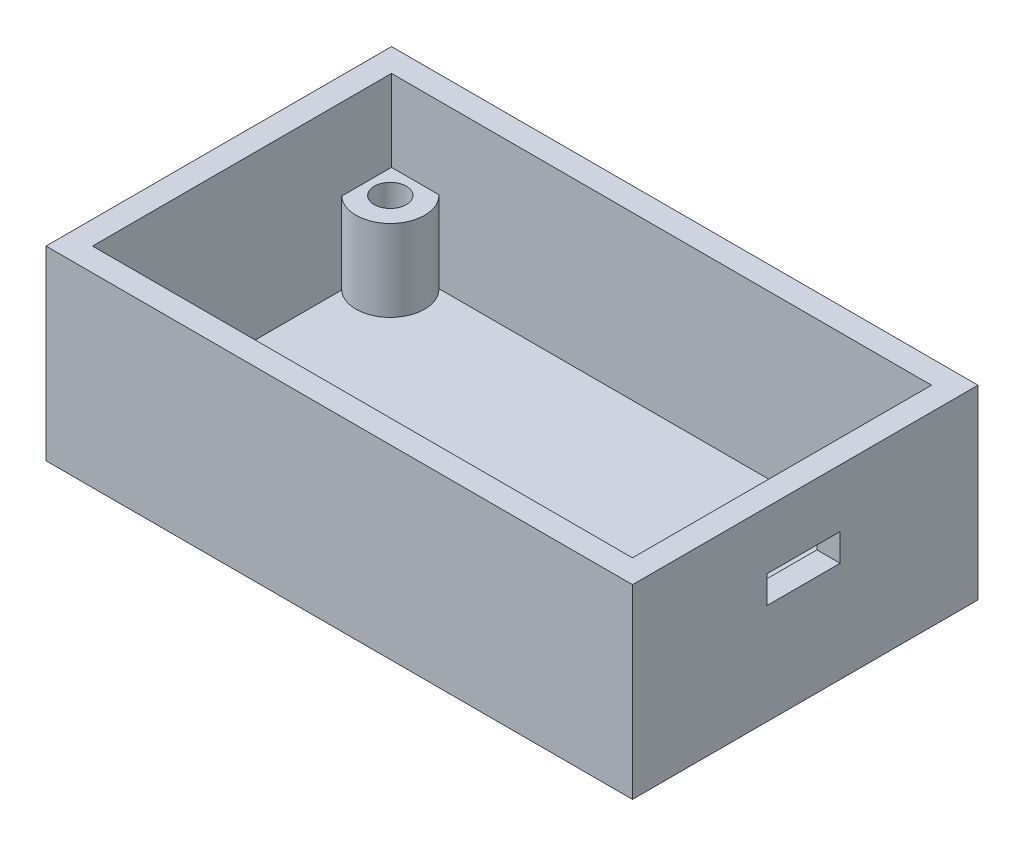
ISO-10303-21;
HEADER;
FILE_DESCRIPTION(('STEP AP214'),'2;1');
FILE_NAME('part.step','',(''),(''),'','','');
FILE_SCHEMA(('AUTOMOTIVE_DESIGN { 1 0 10303 214 1 1 1 1 }'));
ENDSEC;
DATA;
#1=APPLICATION_CONTEXT('core data for automotive mechanical design processes');
#2=APPLICATION_PROTOCOL_DEFINITION('international standard','automotive_design',2000,#1);
#3=PRODUCT_CONTEXT('',#1,'mechanical');
#4=PRODUCT('Part','Part','',(#3));
#5=PRODUCT_RELATED_PRODUCT_CATEGORY('part','',(#4));
#6=PRODUCT_DEFINITION_FORMATION('','',#4);
#7=PRODUCT_DEFINITION_CONTEXT('part definition',#1,'design');
#8=PRODUCT_DEFINITION('design','',#6,#7);
#9=PRODUCT_DEFINITION_SHAPE('','',#8);
#10=(LENGTH_UNIT() NAMED_UNIT(*) SI_UNIT(.MILLI.,.METRE.));
#11=(NAMED_UNIT(*) PLANE_ANGLE_UNIT() SI_UNIT($,.RADIAN.));
#12=(NAMED_UNIT(*) SI_UNIT($,.STERADIAN.) SOLID_ANGLE_UNIT());
#13=UNCERTAINTY_MEASURE_WITH_UNIT(LENGTH_MEASURE(1.E-05),#10,'distance_accuracy_value','');
#14=(GEOMETRIC_REPRESENTATION_CONTEXT(3) GLOBAL_UNCERTAINTY_ASSIGNED_CONTEXT((#13)) GLOBAL_UNIT_ASSIGNED_CONTEXT((#10,
#11,#12)) REPRESENTATION_CONTEXT('',''));
#15=CARTESIAN_POINT('',(0.,0.,0.));
#16=DIRECTION('',(0.,0.,1.));
#17=DIRECTION('',(1.,0.,0.));
#18=AXIS2_PLACEMENT_3D('',#15,#16,#17);
#19=CARTESIAN_POINT('',(-29.5,-17.78,16.3345));
#20=DIRECTION('',(0.,0.,1.));
#21=DIRECTION('',(1.,0.,0.));
#22=AXIS2_PLACEMENT_3D('',#19,#20,#21);
#23=PLANE('',#22);
#24=DIRECTION('',(1.,0.,0.));
#25=VECTOR('',#24,1.);
#26=CARTESIAN_POINT('',(-29.5,-8.89,16.3345));
#27=LINE('',#26,#25);
#28=CARTESIAN_POINT('',(-29.5,-8.89,16.3345));
#29=VERTEX_POINT('',#28);
#30=CARTESIAN_POINT('',(-24.3228,-8.89,16.3345));
#31=VERTEX_POINT('',#30);
#32=EDGE_CURVE('E217',#29,#31,#27,.T.);
#33=ORIENTED_EDGE('',*,*,#32,.F.);
#34=DIRECTION('',(0.,1.,0.));
#35=VECTOR('',#34,1.);
#36=CARTESIAN_POINT('',(-29.5,-17.78,16.3345));
#37=LINE('',#36,#35);
#38=CARTESIAN_POINT('',(-29.5,0.,16.3345));
#39=VERTEX_POINT('',#38);
#40=EDGE_CURVE('E298',#29,#39,#37,.T.);
#41=ORIENTED_EDGE('',*,*,#40,.T.);
#42=DIRECTION('',(1.,0.,0.));
#43=VECTOR('',#42,1.);
#44=CARTESIAN_POINT('',(-29.5,0.,16.3345));
#45=LINE('',#44,#43);
#46=CARTESIAN_POINT('',(29.5,0.,16.3345));
#47=VERTEX_POINT('',#46);
#48=EDGE_CURVE('E276',#39,#47,#45,.T.);
#49=ORIENTED_EDGE('',*,*,#48,.T.);
#50=DIRECTION('',(0.,1.,0.));
#51=VECTOR('',#50,1.);
#52=CARTESIAN_POINT('',(29.5,-17.78,16.3345));
#53=LINE('',#52,#51);
#54=CARTESIAN_POINT('',(29.5,-8.89,16.3345));
#55=VERTEX_POINT('',#54);
#56=EDGE_CURVE('E287',#55,#47,#53,.T.);
#57=ORIENTED_EDGE('',*,*,#56,.F.);
#58=DIRECTION('',(1.,0.,0.));
#59=VECTOR('',#58,1.);
#60=CARTESIAN_POINT('',(29.5,-8.89,16.3345));
#61=LINE('',#60,#59);
#62=CARTESIAN_POINT('',(24.3228,-8.89,16.3345));
#63=VERTEX_POINT('',#62);
#64=EDGE_CURVE('E231',#63,#55,#61,.T.);
#65=ORIENTED_EDGE('',*,*,#64,.F.);
#66=DIRECTION('',(0.,-1.,0.));
#67=VECTOR('',#66,1.);
#68=CARTESIAN_POINT('',(24.3228,-8.89,16.3345));
#69=LINE('',#68,#67);
#70=CARTESIAN_POINT('',(24.3228,-17.78,16.3345));
#71=VERTEX_POINT('',#70);
#72=EDGE_CURVE('E239',#63,#71,#69,.T.);
#73=ORIENTED_EDGE('',*,*,#72,.T.);
#74=DIRECTION('',(1.,0.,0.));
#75=VECTOR('',#74,1.);
#76=CARTESIAN_POINT('',(-29.5,-17.78,16.3345));
#77=LINE('',#76,#75);
#78=CARTESIAN_POINT('',(-24.3228,-17.78,16.3345));
#79=VERTEX_POINT('',#78);
#80=EDGE_CURVE('E277',#79,#71,#77,.T.);
#81=ORIENTED_EDGE('',*,*,#80,.F.);
#82=DIRECTION('',(0.,-1.,0.));
#83=VECTOR('',#82,1.);
#84=CARTESIAN_POINT('',(-24.3228,-8.89,16.3345));
#85=LINE('',#84,#83);
#86=EDGE_CURVE('E219',#31,#79,#85,.T.);
#87=ORIENTED_EDGE('',*,*,#86,.F.);
#88=EDGE_LOOP('',(#33,#41,#49,#57,#65,#73,#81,#87));
#89=FACE_BOUND('',#88,.T.);
#90=ADVANCED_FACE('F35',(#89),#23,.F.);
#91=CARTESIAN_POINT('',(-29.5,-17.78,16.3345));
#92=DIRECTION('',(1.,0.,0.));
#93=DIRECTION('',(0.,0.,-1.));
#94=AXIS2_PLACEMENT_3D('',#91,#92,#93);
#95=PLANE('',#94);
#96=ORIENTED_EDGE('',*,*,#40,.F.);
#97=DIRECTION('',(0.,0.,1.));
#98=VECTOR('',#97,1.);
#99=CARTESIAN_POINT('',(-29.5,-8.89,10.897080826546));
#100=LINE('',#99,#98);
#101=CARTESIAN_POINT('',(-29.5,-8.89,10.897080826546));
#102=VERTEX_POINT('',#101);
#103=EDGE_CURVE('E215',#102,#29,#100,.T.);
#104=ORIENTED_EDGE('',*,*,#103,.F.);
#105=DIRECTION('',(0.,-1.,0.));
#106=VECTOR('',#105,1.);
#107=CARTESIAN_POINT('',(-29.5,-8.89,10.897080826546));
#108=LINE('',#107,#106);
#109=CARTESIAN_POINT('',(-29.5,-17.78,10.897080826546));
#110=VERTEX_POINT('',#109);
#111=EDGE_CURVE('E222',#102,#110,#108,.T.);
#112=ORIENTED_EDGE('',*,*,#111,.T.);
#113=DIRECTION('',(0.,0.,-1.));
#114=VECTOR('',#113,1.);
#115=CARTESIAN_POINT('',(-29.5,-17.78,16.3345));
#116=LINE('',#115,#114);
#117=CARTESIAN_POINT('',(-29.5,-17.78,-10.897080826546));
#118=VERTEX_POINT('',#117);
#119=EDGE_CURVE('E285',#110,#118,#116,.T.);
#120=ORIENTED_EDGE('',*,*,#119,.T.);
#121=DIRECTION('',(0.,-1.,0.));
#122=VECTOR('',#121,1.);
#123=CARTESIAN_POINT('',(-29.5,-8.89,-10.897080826546));
#124=LINE('',#123,#122);
#125=CARTESIAN_POINT('',(-29.5,-8.89,-10.897080826546));
#126=VERTEX_POINT('',#125);
#127=EDGE_CURVE('E269',#126,#118,#124,.T.);
#128=ORIENTED_EDGE('',*,*,#127,.F.);
#129=DIRECTION('',(0.,0.,1.));
#130=VECTOR('',#129,1.);
#131=CARTESIAN_POINT('',(-29.5,-8.89,-10.897080826546));
#132=LINE('',#131,#130);
#133=CARTESIAN_POINT('',(-29.5,-8.89,-16.3345));
#134=VERTEX_POINT('',#133);
#135=EDGE_CURVE('E267',#134,#126,#132,.T.);
#136=ORIENTED_EDGE('',*,*,#135,.F.);
#137=DIRECTION('',(0.,1.,0.));
#138=VECTOR('',#137,1.);
#139=CARTESIAN_POINT('',(-29.5,-17.78,-16.3345));
#140=LINE('',#139,#138);
#141=CARTESIAN_POINT('',(-29.5,0.,-16.3345));
#142=VERTEX_POINT('',#141);
#143=EDGE_CURVE('E301',#134,#142,#140,.T.);
#144=ORIENTED_EDGE('',*,*,#143,.T.);
#145=DIRECTION('',(0.,0.,-1.));
#146=VECTOR('',#145,1.);
#147=CARTESIAN_POINT('',(-29.5,0.,16.3345));
#148=LINE('',#147,#146);
#149=EDGE_CURVE('E280',#39,#142,#148,.T.);
#150=ORIENTED_EDGE('',*,*,#149,.F.);
#151=EDGE_LOOP('',(#96,#104,#112,#120,#128,#136,#144,#150));
#152=FACE_BOUND('',#151,.T.);
#153=ADVANCED_FACE('F376',(#152),#95,.T.);
#154=CARTESIAN_POINT('',(-29.5,-17.78,-16.3345));
#155=DIRECTION('',(0.,0.,1.));
#156=DIRECTION('',(1.,0.,0.));
#157=AXIS2_PLACEMENT_3D('',#154,#155,#156);
#158=PLANE('',#157);
#159=DIRECTION('',(0.,-1.,0.));
#160=VECTOR('',#159,1.);
#161=CARTESIAN_POINT('',(24.3228,-8.89,-16.3345));
#162=LINE('',#161,#160);
#163=CARTESIAN_POINT('',(24.3228,-8.89,-16.3345));
#164=VERTEX_POINT('',#163);
#165=CARTESIAN_POINT('',(24.3228,-17.78,-16.3345));
#166=VERTEX_POINT('',#165);
#167=EDGE_CURVE('E252',#164,#166,#162,.T.);
#168=ORIENTED_EDGE('',*,*,#167,.F.);
#169=DIRECTION('',(-1.,0.,0.));
#170=VECTOR('',#169,1.);
#171=CARTESIAN_POINT('',(29.5,-8.89,-16.3345));
#172=LINE('',#171,#170);
#173=CARTESIAN_POINT('',(29.5,-8.89,-16.3345));
#174=VERTEX_POINT('',#173);
#175=EDGE_CURVE('E250',#174,#164,#172,.T.);
#176=ORIENTED_EDGE('',*,*,#175,.F.);
#177=DIRECTION('',(0.,1.,0.));
#178=VECTOR('',#177,1.);
#179=CARTESIAN_POINT('',(29.5,-17.78,-16.3345));
#180=LINE('',#179,#178);
#181=CARTESIAN_POINT('',(29.5,0.,-16.3345));
#182=VERTEX_POINT('',#181);
#183=EDGE_CURVE('E303',#174,#182,#180,.T.);
#184=ORIENTED_EDGE('',*,*,#183,.T.);
#185=DIRECTION('',(1.,0.,0.));
#186=VECTOR('',#185,1.);
#187=CARTESIAN_POINT('',(-29.5,0.,-16.3345));
#188=LINE('',#187,#186);
#189=EDGE_CURVE('E293',#142,#182,#188,.T.);
#190=ORIENTED_EDGE('',*,*,#189,.F.);
#191=ORIENTED_EDGE('',*,*,#143,.F.);
#192=DIRECTION('',(-1.,0.,0.));
#193=VECTOR('',#192,1.);
#194=CARTESIAN_POINT('',(-29.5,-8.89,-16.3345));
#195=LINE('',#194,#193);
#196=CARTESIAN_POINT('',(-24.3228,-8.89,-16.3345));
#197=VERTEX_POINT('',#196);
#198=EDGE_CURVE('E265',#197,#134,#195,.T.);
#199=ORIENTED_EDGE('',*,*,#198,.F.);
#200=DIRECTION('',(0.,-1.,0.));
#201=VECTOR('',#200,1.);
#202=CARTESIAN_POINT('',(-24.3228,-8.89,-16.3345));
#203=LINE('',#202,#201);
#204=CARTESIAN_POINT('',(-24.3228,-17.78,-16.3345));
#205=VERTEX_POINT('',#204);
#206=EDGE_CURVE('E273',#197,#205,#203,.T.);
#207=ORIENTED_EDGE('',*,*,#206,.T.);
#208=DIRECTION('',(1.,0.,0.));
#209=VECTOR('',#208,1.);
#210=CARTESIAN_POINT('',(-29.5,-17.78,-16.3345));
#211=LINE('',#210,#209);
#212=EDGE_CURVE('E282',#205,#166,#211,.T.);
#213=ORIENTED_EDGE('',*,*,#212,.T.);
#214=EDGE_LOOP('',(#168,#176,#184,#190,#191,#199,#207,#213));
#215=FACE_BOUND('',#214,.T.);
#216=ADVANCED_FACE('F382',(#215),#158,.T.);
#217=CARTESIAN_POINT('',(29.5,-17.78,16.3345));
#218=DIRECTION('',(1.,0.,0.));
#219=DIRECTION('',(0.,0.,-1.));
#220=AXIS2_PLACEMENT_3D('',#217,#218,#219);
#221=PLANE('',#220);
#222=DIRECTION('',(0.,0.,-1.));
#223=VECTOR('',#222,1.);
#224=CARTESIAN_POINT('',(29.5,-9.32,16.3345));
#225=LINE('',#224,#223);
#226=CARTESIAN_POINT('',(29.5,-9.32,4.19));
#227=VERTEX_POINT('',#226);
#228=CARTESIAN_POINT('',(29.5,-9.32,-3.81));
#229=VERTEX_POINT('',#228);
#230=EDGE_CURVE('E203',#227,#229,#225,.T.);
#231=ORIENTED_EDGE('',*,*,#230,.T.);
#232=DIRECTION('',(0.,1.,0.));
#233=VECTOR('',#232,1.);
#234=CARTESIAN_POINT('',(29.5,-17.78,-3.81));
#235=LINE('',#234,#233);
#236=CARTESIAN_POINT('',(29.5,-6.32,-3.81));
#237=VERTEX_POINT('',#236);
#238=EDGE_CURVE('E206',#229,#237,#235,.T.);
#239=ORIENTED_EDGE('',*,*,#238,.T.);
#240=DIRECTION('',(0.,0.,1.));
#241=VECTOR('',#240,1.);
#242=CARTESIAN_POINT('',(29.5,-6.32,16.3345));
#243=LINE('',#242,#241);
#244=CARTESIAN_POINT('',(29.5,-6.32,4.19));
#245=VERTEX_POINT('',#244);
#246=EDGE_CURVE('E198',#237,#245,#243,.T.);
#247=ORIENTED_EDGE('',*,*,#246,.T.);
#248=DIRECTION('',(0.,-1.,0.));
#249=VECTOR('',#248,1.);
#250=CARTESIAN_POINT('',(29.5,-17.78,4.19));
#251=LINE('',#250,#249);
#252=EDGE_CURVE('E178',#245,#227,#251,.T.);
#253=ORIENTED_EDGE('',*,*,#252,.T.);
#254=EDGE_LOOP('',(#231,#239,#247,#253));
#255=FACE_BOUND('',#254,.T.);
#256=DIRECTION('',(0.,-1.,0.));
#257=VECTOR('',#256,1.);
#258=CARTESIAN_POINT('',(29.5,-8.89,10.897080826546));
#259=LINE('',#258,#257);
#260=CARTESIAN_POINT('',(29.5,-8.89,10.897080826546));
#261=VERTEX_POINT('',#260);
#262=CARTESIAN_POINT('',(29.5,-17.78,10.897080826546));
#263=VERTEX_POINT('',#262);
#264=EDGE_CURVE('E235',#261,#263,#259,.T.);
#265=ORIENTED_EDGE('',*,*,#264,.F.);
#266=DIRECTION('',(0.,0.,-1.));
#267=VECTOR('',#266,1.);
#268=CARTESIAN_POINT('',(29.5,-8.89,10.897080826546));
#269=LINE('',#268,#267);
#270=EDGE_CURVE('E233',#55,#261,#269,.T.);
#271=ORIENTED_EDGE('',*,*,#270,.F.);
#272=ORIENTED_EDGE('',*,*,#56,.T.);
#273=DIRECTION('',(0.,0.,-1.));
#274=VECTOR('',#273,1.);
#275=CARTESIAN_POINT('',(29.5,0.,16.3345));
#276=LINE('',#275,#274);
#277=EDGE_CURVE('E290',#47,#182,#276,.T.);
#278=ORIENTED_EDGE('',*,*,#277,.T.);
#279=ORIENTED_EDGE('',*,*,#183,.F.);
#280=DIRECTION('',(0.,0.,-1.));
#281=VECTOR('',#280,1.);
#282=CARTESIAN_POINT('',(29.5,-8.89,-10.897080826546));
#283=LINE('',#282,#281);
#284=CARTESIAN_POINT('',(29.5,-8.89,-10.897080826546));
#285=VERTEX_POINT('',#284);
#286=EDGE_CURVE('E248',#285,#174,#283,.T.);
#287=ORIENTED_EDGE('',*,*,#286,.F.);
#288=DIRECTION('',(0.,-1.,0.));
#289=VECTOR('',#288,1.);
#290=CARTESIAN_POINT('',(29.5,-8.89,-10.897080826546));
#291=LINE('',#290,#289);
#292=CARTESIAN_POINT('',(29.5,-17.78,-10.897080826546));
#293=VERTEX_POINT('',#292);
#294=EDGE_CURVE('E256',#285,#293,#291,.T.);
#295=ORIENTED_EDGE('',*,*,#294,.T.);
#296=DIRECTION('',(0.,0.,-1.));
#297=VECTOR('',#296,1.);
#298=CARTESIAN_POINT('',(29.5,-17.78,16.3345));
#299=LINE('',#298,#297);
#300=EDGE_CURVE('E279',#263,#293,#299,.T.);
#301=ORIENTED_EDGE('',*,*,#300,.F.);
#302=EDGE_LOOP('',(#265,#271,#272,#278,#279,#287,#295,#301));
#303=FACE_BOUND('',#302,.T.);
#304=ADVANCED_FACE('F387',(#255,#303),#221,.F.);
#305=CARTESIAN_POINT('',(-32.04,-20.32,18.8745));
#306=DIRECTION('',(1.,0.,0.));
#307=DIRECTION('',(0.,0.,-1.));
#308=AXIS2_PLACEMENT_3D('',#305,#306,#307);
#309=PLANE('',#308);
#310=DIRECTION('',(0.,0.,-1.));
#311=VECTOR('',#310,1.);
#312=CARTESIAN_POINT('',(-32.04,0.,18.8745));
#313=LINE('',#312,#311);
#314=CARTESIAN_POINT('',(-32.04,0.,18.8745));
#315=VERTEX_POINT('',#314);
#316=CARTESIAN_POINT('',(-32.04,0.,-18.8745));
#317=VERTEX_POINT('',#316);
#318=EDGE_CURVE('E300',#315,#317,#313,.T.);
#319=ORIENTED_EDGE('',*,*,#318,.T.);
#320=DIRECTION('',(0.,1.,0.));
#321=VECTOR('',#320,1.);
#322=CARTESIAN_POINT('',(-32.04,-20.32,-18.8745));
#323=LINE('',#322,#321);
#324=CARTESIAN_POINT('',(-32.04,-20.32,-18.8745));
#325=VERTEX_POINT('',#324);
#326=EDGE_CURVE('E334',#325,#317,#323,.T.);
#327=ORIENTED_EDGE('',*,*,#326,.F.);
#328=DIRECTION('',(0.,0.,-1.));
#329=VECTOR('',#328,1.);
#330=CARTESIAN_POINT('',(-32.04,-20.32,18.8745));
#331=LINE('',#330,#329);
#332=CARTESIAN_POINT('',(-32.04,-20.32,18.8745));
#333=VERTEX_POINT('',#332);
#334=EDGE_CURVE('E306',#333,#325,#331,.T.);
#335=ORIENTED_EDGE('',*,*,#334,.F.);
#336=DIRECTION('',(0.,1.,0.));
#337=VECTOR('',#336,1.);
#338=CARTESIAN_POINT('',(-32.04,-20.32,18.8745));
#339=LINE('',#338,#337);
#340=EDGE_CURVE('E318',#333,#315,#339,.T.);
#341=ORIENTED_EDGE('',*,*,#340,.T.);
#342=EDGE_LOOP('',(#319,#327,#335,#341));
#343=FACE_BOUND('',#342,.T.);
#344=ADVANCED_FACE('F37',(#343),#309,.F.);
#345=CARTESIAN_POINT('',(-32.04,-20.32,-18.8745));
#346=DIRECTION('',(0.,0.,1.));
#347=DIRECTION('',(1.,0.,0.));
#348=AXIS2_PLACEMENT_3D('',#345,#346,#347);
#349=PLANE('',#348);
#350=DIRECTION('',(1.,0.,0.));
#351=VECTOR('',#350,1.);
#352=CARTESIAN_POINT('',(-32.04,0.,-18.8745));
#353=LINE('',#352,#351);
#354=CARTESIAN_POINT('',(32.04,0.,-18.8745));
#355=VERTEX_POINT('',#354);
#356=EDGE_CURVE('E321',#317,#355,#353,.T.);
#357=ORIENTED_EDGE('',*,*,#356,.T.);
#358=DIRECTION('',(0.,1.,0.));
#359=VECTOR('',#358,1.);
#360=CARTESIAN_POINT('',(32.04,-20.32,-18.8745));
#361=LINE('',#360,#359);
#362=CARTESIAN_POINT('',(32.04,-20.32,-18.8745));
#363=VERTEX_POINT('',#362);
#364=EDGE_CURVE('E332',#363,#355,#361,.T.);
#365=ORIENTED_EDGE('',*,*,#364,.F.);
#366=DIRECTION('',(1.,0.,0.));
#367=VECTOR('',#366,1.);
#368=CARTESIAN_POINT('',(-32.04,-20.32,-18.8745));
#369=LINE('',#368,#367);
#370=EDGE_CURVE('E309',#325,#363,#369,.T.);
#371=ORIENTED_EDGE('',*,*,#370,.F.);
#372=ORIENTED_EDGE('',*,*,#326,.T.);
#373=EDGE_LOOP('',(#357,#365,#371,#372));
#374=FACE_BOUND('',#373,.T.);
#375=ADVANCED_FACE('F402',(#374),#349,.F.);
#376=CARTESIAN_POINT('',(32.04,-20.32,18.8745));
#377=DIRECTION('',(1.,0.,0.));
#378=DIRECTION('',(0.,0.,-1.));
#379=AXIS2_PLACEMENT_3D('',#376,#377,#378);
#380=PLANE('',#379);
#381=DIRECTION('',(0.,1.,0.));
#382=VECTOR('',#381,1.);
#383=CARTESIAN_POINT('',(32.04,-6.32,-3.81000000000001));
#384=LINE('',#383,#382);
#385=CARTESIAN_POINT('',(32.04,-9.32,-3.81000000000001));
#386=VERTEX_POINT('',#385);
#387=CARTESIAN_POINT('',(32.04,-6.32,-3.81));
#388=VERTEX_POINT('',#387);
#389=EDGE_CURVE('E58',#386,#388,#384,.T.);
#390=ORIENTED_EDGE('',*,*,#389,.F.);
#391=DIRECTION('',(0.,0.,-1.));
#392=VECTOR('',#391,1.);
#393=CARTESIAN_POINT('',(32.04,-9.32,4.19));
#394=LINE('',#393,#392);
#395=CARTESIAN_POINT('',(32.04,-9.32,4.19));
#396=VERTEX_POINT('',#395);
#397=EDGE_CURVE('E191',#396,#386,#394,.T.);
#398=ORIENTED_EDGE('',*,*,#397,.F.);
#399=DIRECTION('',(0.,-1.,0.));
#400=VECTOR('',#399,1.);
#401=CARTESIAN_POINT('',(32.04,-6.32,4.19));
#402=LINE('',#401,#400);
#403=CARTESIAN_POINT('',(32.04,-6.32,4.19));
#404=VERTEX_POINT('',#403);
#405=EDGE_CURVE('E175',#404,#396,#402,.T.);
#406=ORIENTED_EDGE('',*,*,#405,.F.);
#407=DIRECTION('',(0.,0.,1.));
#408=VECTOR('',#407,1.);
#409=CARTESIAN_POINT('',(32.04,-6.32,4.19));
#410=LINE('',#409,#408);
#411=EDGE_CURVE('E184',#388,#404,#410,.T.);
#412=ORIENTED_EDGE('',*,*,#411,.F.);
#413=EDGE_LOOP('',(#390,#398,#406,#412));
#414=FACE_BOUND('',#413,.T.);
#415=DIRECTION('',(0.,0.,-1.));
#416=VECTOR('',#415,1.);
#417=CARTESIAN_POINT('',(32.04,0.,18.8745));
#418=LINE('',#417,#416);
#419=CARTESIAN_POINT('',(32.04,0.,18.8745));
#420=VERTEX_POINT('',#419);
#421=EDGE_CURVE('E324',#420,#355,#418,.T.);
#422=ORIENTED_EDGE('',*,*,#421,.F.);
#423=DIRECTION('',(0.,1.,0.));
#424=VECTOR('',#423,1.);
#425=CARTESIAN_POINT('',(32.04,-20.32,18.8745));
#426=LINE('',#425,#424);
#427=CARTESIAN_POINT('',(32.04,-20.32,18.8745));
#428=VERTEX_POINT('',#427);
#429=EDGE_CURVE('E330',#428,#420,#426,.T.);
#430=ORIENTED_EDGE('',*,*,#429,.F.);
#431=DIRECTION('',(0.,0.,-1.));
#432=VECTOR('',#431,1.);
#433=CARTESIAN_POINT('',(32.04,-20.32,18.8745));
#434=LINE('',#433,#432);
#435=EDGE_CURVE('E312',#428,#363,#434,.T.);
#436=ORIENTED_EDGE('',*,*,#435,.T.);
#437=ORIENTED_EDGE('',*,*,#364,.T.);
#438=EDGE_LOOP('',(#422,#430,#436,#437));
#439=FACE_BOUND('',#438,.T.);
#440=ADVANCED_FACE('F188',(#414,#439),#380,.T.);
#441=CARTESIAN_POINT('',(-32.04,-20.32,18.8745));
#442=DIRECTION('',(0.,0.,1.));
#443=DIRECTION('',(1.,0.,0.));
#444=AXIS2_PLACEMENT_3D('',#441,#442,#443);
#445=PLANE('',#444);
#446=DIRECTION('',(1.,0.,0.));
#447=VECTOR('',#446,1.);
#448=CARTESIAN_POINT('',(-32.04,0.,18.8745));
#449=LINE('',#448,#447);
#450=EDGE_CURVE('E310',#315,#420,#449,.T.);
#451=ORIENTED_EDGE('',*,*,#450,.F.);
#452=ORIENTED_EDGE('',*,*,#340,.F.);
#453=DIRECTION('',(1.,0.,0.));
#454=VECTOR('',#453,1.);
#455=CARTESIAN_POINT('',(-32.04,-20.32,18.8745));
#456=LINE('',#455,#454);
#457=EDGE_CURVE('E315',#333,#428,#456,.T.);
#458=ORIENTED_EDGE('',*,*,#457,.T.);
#459=ORIENTED_EDGE('',*,*,#429,.T.);
#460=EDGE_LOOP('',(#451,#452,#458,#459));
#461=FACE_BOUND('',#460,.T.);
#462=ADVANCED_FACE('F393',(#461),#445,.T.);
#463=CARTESIAN_POINT('',(0.,-20.32,0.));
#464=DIRECTION('',(0.,-1.,0.));
#465=DIRECTION('',(0.,0.,-1.));
#466=AXIS2_PLACEMENT_3D('',#463,#464,#465);
#467=PLANE('',#466);
#468=ORIENTED_EDGE('',*,*,#334,.T.);
#469=ORIENTED_EDGE('',*,*,#370,.T.);
#470=ORIENTED_EDGE('',*,*,#435,.F.);
#471=ORIENTED_EDGE('',*,*,#457,.F.);
#472=EDGE_LOOP('',(#468,#469,#470,#471));
#473=FACE_BOUND('',#472,.T.);
#474=ADVANCED_FACE('F389',(#473),#467,.T.);
#475=CARTESIAN_POINT('',(0.,0.,0.));
#476=DIRECTION('',(0.,-1.,0.));
#477=DIRECTION('',(0.,0.,-1.));
#478=AXIS2_PLACEMENT_3D('',#475,#476,#477);
#479=PLANE('',#478);
#480=ORIENTED_EDGE('',*,*,#277,.F.);
#481=ORIENTED_EDGE('',*,*,#48,.F.);
#482=ORIENTED_EDGE('',*,*,#149,.T.);
#483=ORIENTED_EDGE('',*,*,#189,.T.);
#484=EDGE_LOOP('',(#480,#481,#482,#483));
#485=FACE_BOUND('',#484,.T.);
#486=ORIENTED_EDGE('',*,*,#318,.F.);
#487=ORIENTED_EDGE('',*,*,#450,.T.);
#488=ORIENTED_EDGE('',*,*,#421,.T.);
#489=ORIENTED_EDGE('',*,*,#356,.F.);
#490=EDGE_LOOP('',(#486,#487,#488,#489));
#491=FACE_BOUND('',#490,.T.);
#492=ADVANCED_FACE('F392',(#485,#491),#479,.F.);
#493=CARTESIAN_POINT('',(0.,-17.78,0.));
#494=DIRECTION('',(0.,1.,0.));
#495=DIRECTION('',(0.,0.,1.));
#496=AXIS2_PLACEMENT_3D('',#493,#494,#495);
#497=PLANE('',#496);
#498=ORIENTED_EDGE('',*,*,#119,.F.);
#499=CARTESIAN_POINT('',(-26.9114,-17.78,13.615790413273));
#500=DIRECTION('',(0.,1.,0.));
#501=DIRECTION('',(0.,0.,-1.));
#502=AXIS2_PLACEMENT_3D('',#499,#500,#501);
#503=CIRCLE('',#502,3.75396214378372);
#504=EDGE_CURVE('E212',#79,#110,#503,.T.);
#505=ORIENTED_EDGE('',*,*,#504,.F.);
#506=ORIENTED_EDGE('',*,*,#80,.T.);
#507=CARTESIAN_POINT('',(26.9114,-17.78,13.615790413273));
#508=DIRECTION('',(0.,1.,0.));
#509=DIRECTION('',(0.,0.,1.));
#510=AXIS2_PLACEMENT_3D('',#507,#508,#509);
#511=CIRCLE('',#510,3.75396214378372);
#512=EDGE_CURVE('E228',#263,#71,#511,.T.);
#513=ORIENTED_EDGE('',*,*,#512,.F.);
#514=ORIENTED_EDGE('',*,*,#300,.T.);
#515=CARTESIAN_POINT('',(26.9114,-17.78,-13.6157904132731));
#516=DIRECTION('',(0.,1.,0.));
#517=DIRECTION('',(0.,0.,-1.));
#518=AXIS2_PLACEMENT_3D('',#515,#516,#517);
#519=CIRCLE('',#518,3.75396214378372);
#520=EDGE_CURVE('E245',#166,#293,#519,.T.);
#521=ORIENTED_EDGE('',*,*,#520,.F.);
#522=ORIENTED_EDGE('',*,*,#212,.F.);
#523=CARTESIAN_POINT('',(-26.9114,-17.78,-13.615790413273));
#524=DIRECTION('',(0.,1.,0.));
#525=DIRECTION('',(0.,0.,1.));
#526=AXIS2_PLACEMENT_3D('',#523,#524,#525);
#527=CIRCLE('',#526,3.75396214378372);
#528=EDGE_CURVE('E262',#118,#205,#527,.T.);
#529=ORIENTED_EDGE('',*,*,#528,.F.);
#530=EDGE_LOOP('',(#498,#505,#506,#513,#514,#521,#522,#529));
#531=FACE_BOUND('',#530,.T.);
#532=ADVANCED_FACE('F363',(#531),#497,.T.);
#533=CARTESIAN_POINT('',(-26.9114,-8.89,-13.615790413273));
#534=DIRECTION('',(0.,1.,0.));
#535=DIRECTION('',(0.,0.,1.));
#536=AXIS2_PLACEMENT_3D('',#533,#534,#535);
#537=PLANE('',#536);
#538=CARTESIAN_POINT('',(-26.9114,-8.89,-13.615790413273));
#539=DIRECTION('',(0.,1.,0.));
#540=DIRECTION('',(0.,0.,1.));
#541=AXIS2_PLACEMENT_3D('',#538,#539,#540);
#542=CIRCLE('',#541,3.75396214378372);
#543=EDGE_CURVE('E263',#126,#197,#542,.T.);
#544=ORIENTED_EDGE('',*,*,#543,.T.);
#545=ORIENTED_EDGE('',*,*,#198,.T.);
#546=ORIENTED_EDGE('',*,*,#135,.T.);
#547=EDGE_LOOP('',(#544,#545,#546));
#548=FACE_BOUND('',#547,.T.);
#549=CARTESIAN_POINT('',(-26.9114,-8.89,-13.615790413273));
#550=DIRECTION('',(0.,1.,0.));
#551=DIRECTION('',(0.,0.,1.));
#552=AXIS2_PLACEMENT_3D('',#549,#550,#551);
#553=CIRCLE('',#552,1.75);
#554=CARTESIAN_POINT('',(-26.9114,-8.89,-11.865790413273));
#555=VERTEX_POINT('',#554);
#556=EDGE_CURVE('E259',#555,#555,#553,.T.);
#557=ORIENTED_EDGE('',*,*,#556,.F.);
#558=EDGE_LOOP('',(#557));
#559=FACE_BOUND('',#558,.T.);
#560=ADVANCED_FACE('F469',(#548,#559),#537,.T.);
#561=CARTESIAN_POINT('',(-26.9114,-8.89,-13.615790413273));
#562=DIRECTION('',(0.,-1.,0.));
#563=DIRECTION('',(0.,0.,-1.));
#564=AXIS2_PLACEMENT_3D('',#561,#562,#563);
#565=CYLINDRICAL_SURFACE('',#564,3.75396214378372);
#566=ORIENTED_EDGE('',*,*,#528,.T.);
#567=ORIENTED_EDGE('',*,*,#206,.F.);
#568=ORIENTED_EDGE('',*,*,#543,.F.);
#569=ORIENTED_EDGE('',*,*,#127,.T.);
#570=EDGE_LOOP('',(#566,#567,#568,#569));
#571=FACE_BOUND('',#570,.T.);
#572=ADVANCED_FACE('F467',(#571),#565,.T.);
#573=CARTESIAN_POINT('',(-26.9114,-8.89,-13.615790413273));
#574=DIRECTION('',(0.,-1.,0.));
#575=DIRECTION('',(0.,0.,-1.));
#576=AXIS2_PLACEMENT_3D('',#573,#574,#575);
#577=CYLINDRICAL_SURFACE('',#576,1.75);
#578=ORIENTED_EDGE('',*,*,#556,.T.);
#579=EDGE_LOOP('',(#578));
#580=FACE_BOUND('',#579,.T.);
#581=CARTESIAN_POINT('',(-26.9114,-17.78,-13.615790413273));
#582=DIRECTION('',(0.,1.,0.));
#583=DIRECTION('',(0.,0.,1.));
#584=AXIS2_PLACEMENT_3D('',#581,#582,#583);
#585=CIRCLE('',#584,1.75);
#586=CARTESIAN_POINT('',(-26.9114,-17.78,-11.865790413273));
#587=VERTEX_POINT('',#586);
#588=EDGE_CURVE('E337',#587,#587,#585,.F.);
#589=ORIENTED_EDGE('',*,*,#588,.T.);
#590=EDGE_LOOP('',(#589));
#591=FACE_BOUND('',#590,.T.);
#592=ADVANCED_FACE('F464',(#580,#591),#577,.F.);
#593=ORIENTED_EDGE('',*,*,#588,.F.);
#594=EDGE_LOOP('',(#593));
#595=FACE_BOUND('',#594,.T.);
#596=ADVANCED_FACE('F370',(#595),#497,.T.);
#597=CARTESIAN_POINT('',(26.9114,-8.89,-13.6157904132731));
#598=DIRECTION('',(0.,-1.,0.));
#599=DIRECTION('',(0.,0.,-1.));
#600=AXIS2_PLACEMENT_3D('',#597,#598,#599);
#601=PLANE('',#600);
#602=CARTESIAN_POINT('',(26.9114,-8.89,-13.6157904132731));
#603=DIRECTION('',(0.,1.,0.));
#604=DIRECTION('',(0.,0.,-1.));
#605=AXIS2_PLACEMENT_3D('',#602,#603,#604);
#606=CIRCLE('',#605,3.75396214378372);
#607=EDGE_CURVE('E246',#164,#285,#606,.T.);
#608=ORIENTED_EDGE('',*,*,#607,.T.);
#609=ORIENTED_EDGE('',*,*,#286,.T.);
#610=ORIENTED_EDGE('',*,*,#175,.T.);
#611=EDGE_LOOP('',(#608,#609,#610));
#612=FACE_BOUND('',#611,.T.);
#613=CARTESIAN_POINT('',(26.9114,-8.89,-13.6157904132731));
#614=DIRECTION('',(0.,1.,0.));
#615=DIRECTION('',(0.,0.,1.));
#616=AXIS2_PLACEMENT_3D('',#613,#614,#615);
#617=CIRCLE('',#616,1.75);
#618=CARTESIAN_POINT('',(26.9114,-8.89,-11.8657904132731));
#619=VERTEX_POINT('',#618);
#620=EDGE_CURVE('E242',#619,#619,#617,.T.);
#621=ORIENTED_EDGE('',*,*,#620,.F.);
#622=EDGE_LOOP('',(#621));
#623=FACE_BOUND('',#622,.T.);
#624=ADVANCED_FACE('F457',(#612,#623),#601,.F.);
#625=CARTESIAN_POINT('',(26.9114,-8.89,-13.6157904132731));
#626=DIRECTION('',(0.,-1.,0.));
#627=DIRECTION('',(0.,0.,-1.));
#628=AXIS2_PLACEMENT_3D('',#625,#626,#627);
#629=CYLINDRICAL_SURFACE('',#628,3.75396214378372);
#630=ORIENTED_EDGE('',*,*,#520,.T.);
#631=ORIENTED_EDGE('',*,*,#294,.F.);
#632=ORIENTED_EDGE('',*,*,#607,.F.);
#633=ORIENTED_EDGE('',*,*,#167,.T.);
#634=EDGE_LOOP('',(#630,#631,#632,#633));
#635=FACE_BOUND('',#634,.T.);
#636=ADVANCED_FACE('F455',(#635),#629,.T.);
#637=CARTESIAN_POINT('',(26.9114,-8.89,-13.6157904132731));
#638=DIRECTION('',(0.,-1.,0.));
#639=DIRECTION('',(0.,0.,-1.));
#640=AXIS2_PLACEMENT_3D('',#637,#638,#639);
#641=CYLINDRICAL_SURFACE('',#640,1.75);
#642=ORIENTED_EDGE('',*,*,#620,.T.);
#643=EDGE_LOOP('',(#642));
#644=FACE_BOUND('',#643,.T.);
#645=CARTESIAN_POINT('',(26.9114,-17.78,-13.6157904132731));
#646=DIRECTION('',(0.,1.,0.));
#647=DIRECTION('',(0.,0.,1.));
#648=AXIS2_PLACEMENT_3D('',#645,#646,#647);
#649=CIRCLE('',#648,1.75);
#650=CARTESIAN_POINT('',(26.9114,-17.78,-11.8657904132731));
#651=VERTEX_POINT('',#650);
#652=EDGE_CURVE('E340',#651,#651,#649,.F.);
#653=ORIENTED_EDGE('',*,*,#652,.T.);
#654=EDGE_LOOP('',(#653));
#655=FACE_BOUND('',#654,.T.);
#656=ADVANCED_FACE('F368',(#644,#655),#641,.F.);
#657=ORIENTED_EDGE('',*,*,#652,.F.);
#658=EDGE_LOOP('',(#657));
#659=FACE_BOUND('',#658,.T.);
#660=ADVANCED_FACE('F351',(#659),#497,.T.);
#661=CARTESIAN_POINT('',(26.9114,-8.89,13.615790413273));
#662=DIRECTION('',(0.,1.,0.));
#663=DIRECTION('',(0.,0.,1.));
#664=AXIS2_PLACEMENT_3D('',#661,#662,#663);
#665=PLANE('',#664);
#666=CARTESIAN_POINT('',(26.9114,-8.89,13.615790413273));
#667=DIRECTION('',(0.,1.,0.));
#668=DIRECTION('',(0.,0.,1.));
#669=AXIS2_PLACEMENT_3D('',#666,#667,#668);
#670=CIRCLE('',#669,3.75396214378372);
#671=EDGE_CURVE('E229',#261,#63,#670,.T.);
#672=ORIENTED_EDGE('',*,*,#671,.T.);
#673=ORIENTED_EDGE('',*,*,#64,.T.);
#674=ORIENTED_EDGE('',*,*,#270,.T.);
#675=EDGE_LOOP('',(#672,#673,#674));
#676=FACE_BOUND('',#675,.T.);
#677=CARTESIAN_POINT('',(26.9114,-8.89,13.615790413273));
#678=DIRECTION('',(0.,1.,0.));
#679=DIRECTION('',(0.,0.,1.));
#680=AXIS2_PLACEMENT_3D('',#677,#678,#679);
#681=CIRCLE('',#680,1.75);
#682=CARTESIAN_POINT('',(26.9114,-8.89,15.3657904132729));
#683=VERTEX_POINT('',#682);
#684=EDGE_CURVE('E225',#683,#683,#681,.T.);
#685=ORIENTED_EDGE('',*,*,#684,.F.);
#686=EDGE_LOOP('',(#685));
#687=FACE_BOUND('',#686,.T.);
#688=ADVANCED_FACE('F367',(#676,#687),#665,.T.);
#689=CARTESIAN_POINT('',(26.9114,-8.89,13.615790413273));
#690=DIRECTION('',(0.,-1.,0.));
#691=DIRECTION('',(0.,0.,-1.));
#692=AXIS2_PLACEMENT_3D('',#689,#690,#691);
#693=CYLINDRICAL_SURFACE('',#692,3.75396214378372);
#694=ORIENTED_EDGE('',*,*,#512,.T.);
#695=ORIENTED_EDGE('',*,*,#72,.F.);
#696=ORIENTED_EDGE('',*,*,#671,.F.);
#697=ORIENTED_EDGE('',*,*,#264,.T.);
#698=EDGE_LOOP('',(#694,#695,#696,#697));
#699=FACE_BOUND('',#698,.T.);
#700=ADVANCED_FACE('F360',(#699),#693,.T.);
#701=CARTESIAN_POINT('',(26.9114,-8.89,13.615790413273));
#702=DIRECTION('',(0.,-1.,0.));
#703=DIRECTION('',(0.,0.,-1.));
#704=AXIS2_PLACEMENT_3D('',#701,#702,#703);
#705=CYLINDRICAL_SURFACE('',#704,1.75);
#706=ORIENTED_EDGE('',*,*,#684,.T.);
#707=EDGE_LOOP('',(#706));
#708=FACE_BOUND('',#707,.T.);
#709=CARTESIAN_POINT('',(26.9114,-17.78,13.615790413273));
#710=DIRECTION('',(0.,1.,0.));
#711=DIRECTION('',(0.,0.,1.));
#712=AXIS2_PLACEMENT_3D('',#709,#710,#711);
#713=CIRCLE('',#712,1.75);
#714=CARTESIAN_POINT('',(26.9114,-17.78,15.3657904132729));
#715=VERTEX_POINT('',#714);
#716=EDGE_CURVE('E43',#715,#715,#713,.F.);
#717=ORIENTED_EDGE('',*,*,#716,.T.);
#718=EDGE_LOOP('',(#717));
#719=FACE_BOUND('',#718,.T.);
#720=ADVANCED_FACE('F345',(#708,#719),#705,.F.);
#721=ORIENTED_EDGE('',*,*,#716,.F.);
#722=EDGE_LOOP('',(#721));
#723=FACE_BOUND('',#722,.T.);
#724=ADVANCED_FACE('F347',(#723),#497,.T.);
#725=CARTESIAN_POINT('',(-26.9114,-8.89,13.615790413273));
#726=DIRECTION('',(0.,-1.,0.));
#727=DIRECTION('',(0.,0.,-1.));
#728=AXIS2_PLACEMENT_3D('',#725,#726,#727);
#729=PLANE('',#728);
#730=CARTESIAN_POINT('',(-26.9114,-8.89,13.615790413273));
#731=DIRECTION('',(0.,1.,0.));
#732=DIRECTION('',(0.,0.,-1.));
#733=AXIS2_PLACEMENT_3D('',#730,#731,#732);
#734=CIRCLE('',#733,3.75396214378372);
#735=EDGE_CURVE('E213',#31,#102,#734,.T.);
#736=ORIENTED_EDGE('',*,*,#735,.T.);
#737=ORIENTED_EDGE('',*,*,#103,.T.);
#738=ORIENTED_EDGE('',*,*,#32,.T.);
#739=EDGE_LOOP('',(#736,#737,#738));
#740=FACE_BOUND('',#739,.T.);
#741=CARTESIAN_POINT('',(-26.9114,-8.89,13.615790413273));
#742=DIRECTION('',(0.,1.,0.));
#743=DIRECTION('',(0.,0.,1.));
#744=AXIS2_PLACEMENT_3D('',#741,#742,#743);
#745=CIRCLE('',#744,1.75);
#746=CARTESIAN_POINT('',(-26.9114,-8.89,15.365790413273));
#747=VERTEX_POINT('',#746);
#748=EDGE_CURVE('E209',#747,#747,#745,.T.);
#749=ORIENTED_EDGE('',*,*,#748,.F.);
#750=EDGE_LOOP('',(#749));
#751=FACE_BOUND('',#750,.T.);
#752=ADVANCED_FACE('F349',(#740,#751),#729,.F.);
#753=CARTESIAN_POINT('',(-26.9114,-8.89,13.615790413273));
#754=DIRECTION('',(0.,-1.,0.));
#755=DIRECTION('',(0.,0.,-1.));
#756=AXIS2_PLACEMENT_3D('',#753,#754,#755);
#757=CYLINDRICAL_SURFACE('',#756,3.75396214378372);
#758=ORIENTED_EDGE('',*,*,#504,.T.);
#759=ORIENTED_EDGE('',*,*,#111,.F.);
#760=ORIENTED_EDGE('',*,*,#735,.F.);
#761=ORIENTED_EDGE('',*,*,#86,.T.);
#762=EDGE_LOOP('',(#758,#759,#760,#761));
#763=FACE_BOUND('',#762,.T.);
#764=ADVANCED_FACE('F357',(#763),#757,.T.);
#765=CARTESIAN_POINT('',(-26.9114,-8.89,13.615790413273));
#766=DIRECTION('',(0.,-1.,0.));
#767=DIRECTION('',(0.,0.,-1.));
#768=AXIS2_PLACEMENT_3D('',#765,#766,#767);
#769=CYLINDRICAL_SURFACE('',#768,1.75);
#770=ORIENTED_EDGE('',*,*,#748,.T.);
#771=EDGE_LOOP('',(#770));
#772=FACE_BOUND('',#771,.T.);
#773=CARTESIAN_POINT('',(-26.9114,-17.78,13.615790413273));
#774=DIRECTION('',(0.,1.,0.));
#775=DIRECTION('',(0.,0.,1.));
#776=AXIS2_PLACEMENT_3D('',#773,#774,#775);
#777=CIRCLE('',#776,1.75);
#778=CARTESIAN_POINT('',(-26.9114,-17.78,15.365790413273));
#779=VERTEX_POINT('',#778);
#780=EDGE_CURVE('E11',#779,#779,#777,.F.);
#781=ORIENTED_EDGE('',*,*,#780,.T.);
#782=EDGE_LOOP('',(#781));
#783=FACE_BOUND('',#782,.T.);
#784=ADVANCED_FACE('F373',(#772,#783),#769,.F.);
#785=ORIENTED_EDGE('',*,*,#780,.F.);
#786=EDGE_LOOP('',(#785));
#787=FACE_BOUND('',#786,.T.);
#788=ADVANCED_FACE('F352',(#787),#497,.T.);
#789=CARTESIAN_POINT('',(23.15,-6.32,-3.81));
#790=DIRECTION('',(0.,0.,-1.));
#791=DIRECTION('',(-1.,0.,0.));
#792=AXIS2_PLACEMENT_3D('',#789,#790,#791);
#793=PLANE('',#792);
#794=DIRECTION('',(1.,0.,0.));
#795=VECTOR('',#794,1.);
#796=CARTESIAN_POINT('',(23.15,-9.32,-3.81));
#797=LINE('',#796,#795);
#798=EDGE_CURVE('E196',#229,#386,#797,.T.);
#799=ORIENTED_EDGE('',*,*,#798,.T.);
#800=ORIENTED_EDGE('',*,*,#389,.T.);
#801=DIRECTION('',(1.,0.,0.));
#802=VECTOR('',#801,1.);
#803=CARTESIAN_POINT('',(23.15,-6.32,-3.81));
#804=LINE('',#803,#802);
#805=EDGE_CURVE('E181',#237,#388,#804,.T.);
#806=ORIENTED_EDGE('',*,*,#805,.F.);
#807=ORIENTED_EDGE('',*,*,#238,.F.);
#808=EDGE_LOOP('',(#799,#800,#806,#807));
#809=FACE_BOUND('',#808,.T.);
#810=ADVANCED_FACE('F372',(#809),#793,.F.);
#811=CARTESIAN_POINT('',(23.15,-9.32,4.19));
#812=DIRECTION('',(0.,-1.,0.));
#813=DIRECTION('',(0.,0.,-1.));
#814=AXIS2_PLACEMENT_3D('',#811,#812,#813);
#815=PLANE('',#814);
#816=DIRECTION('',(1.,0.,0.));
#817=VECTOR('',#816,1.);
#818=CARTESIAN_POINT('',(23.15,-9.32,4.19));
#819=LINE('',#818,#817);
#820=EDGE_CURVE('E180',#227,#396,#819,.T.);
#821=ORIENTED_EDGE('',*,*,#820,.T.);
#822=ORIENTED_EDGE('',*,*,#397,.T.);
#823=ORIENTED_EDGE('',*,*,#798,.F.);
#824=ORIENTED_EDGE('',*,*,#230,.F.);
#825=EDGE_LOOP('',(#821,#822,#823,#824));
#826=FACE_BOUND('',#825,.T.);
#827=ADVANCED_FACE('F626',(#826),#815,.F.);
#828=CARTESIAN_POINT('',(23.15,-6.32,4.19));
#829=DIRECTION('',(0.,0.,1.));
#830=DIRECTION('',(0.,-1.,0.));
#831=AXIS2_PLACEMENT_3D('',#828,#829,#830);
#832=PLANE('',#831);
#833=DIRECTION('',(1.,0.,0.));
#834=VECTOR('',#833,1.);
#835=CARTESIAN_POINT('',(23.15,-6.32,4.19));
#836=LINE('',#835,#834);
#837=EDGE_CURVE('E50',#245,#404,#836,.T.);
#838=ORIENTED_EDGE('',*,*,#837,.T.);
#839=ORIENTED_EDGE('',*,*,#405,.T.);
#840=ORIENTED_EDGE('',*,*,#820,.F.);
#841=ORIENTED_EDGE('',*,*,#252,.F.);
#842=EDGE_LOOP('',(#838,#839,#840,#841));
#843=FACE_BOUND('',#842,.T.);
#844=ADVANCED_FACE('F172',(#843),#832,.F.);
#845=CARTESIAN_POINT('',(23.15,-6.32,4.19));
#846=DIRECTION('',(0.,1.,0.));
#847=DIRECTION('',(0.,0.,1.));
#848=AXIS2_PLACEMENT_3D('',#845,#846,#847);
#849=PLANE('',#848);
#850=ORIENTED_EDGE('',*,*,#805,.T.);
#851=ORIENTED_EDGE('',*,*,#411,.T.);
#852=ORIENTED_EDGE('',*,*,#837,.F.);
#853=ORIENTED_EDGE('',*,*,#246,.F.);
#854=EDGE_LOOP('',(#850,#851,#852,#853));
#855=FACE_BOUND('',#854,.T.);
#856=ADVANCED_FACE('F185',(#855),#849,.F.);
#857=CLOSED_SHELL('',(#90,#153,#216,#304,#344,#375,#440,#462,#474,#492,#532,#560,#572,#592,#596,
#624,#636,#656,#660,#688,#700,#720,#724,#752,#764,#784,#788,#810,#827,#844,#856));
#858=MANIFOLD_SOLID_BREP('B2',#857);
#859=ADVANCED_BREP_SHAPE_REPRESENTATION('',(#18,#858),#14);
#860=SHAPE_DEFINITION_REPRESENTATION(#9,#859);
ENDSEC;
END-ISO-10303-21;
